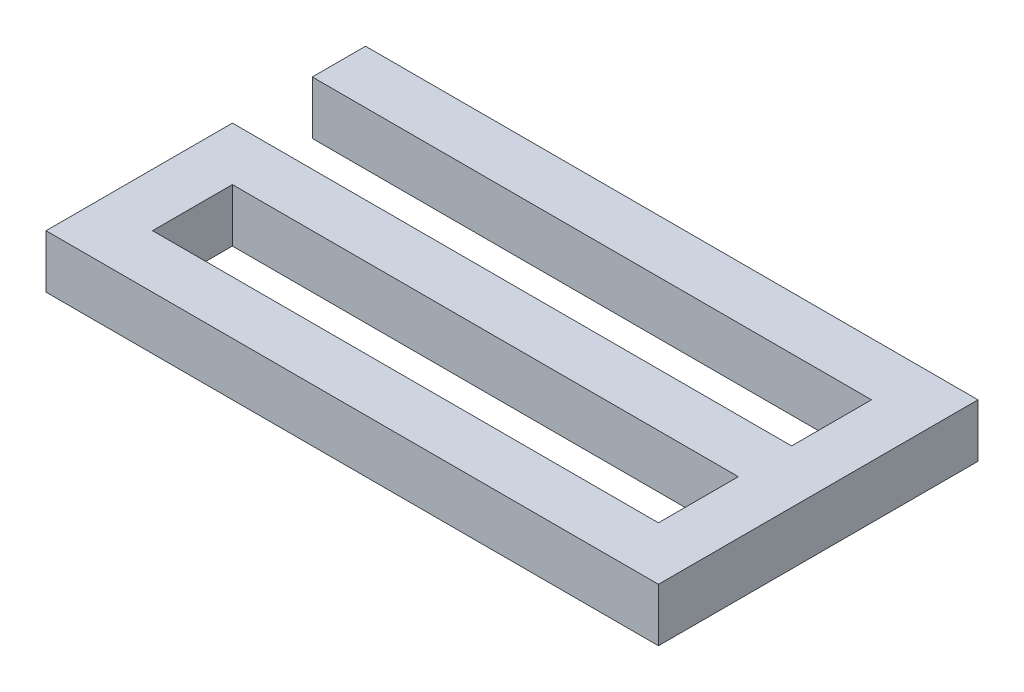
ISO-10303-21;
HEADER;
FILE_DESCRIPTION(('STEP AP214'),'2;1');
FILE_NAME('part.step','',(''),(''),'','','');
FILE_SCHEMA(('AUTOMOTIVE_DESIGN { 1 0 10303 214 1 1 1 1 }'));
ENDSEC;
DATA;
#1=APPLICATION_CONTEXT('core data for automotive mechanical design processes');
#2=APPLICATION_PROTOCOL_DEFINITION('international standard','automotive_design',2000,#1);
#3=PRODUCT_CONTEXT('',#1,'mechanical');
#4=PRODUCT('Part','Part','',(#3));
#5=PRODUCT_RELATED_PRODUCT_CATEGORY('part','',(#4));
#6=PRODUCT_DEFINITION_FORMATION('','',#4);
#7=PRODUCT_DEFINITION_CONTEXT('part definition',#1,'design');
#8=PRODUCT_DEFINITION('design','',#6,#7);
#9=PRODUCT_DEFINITION_SHAPE('','',#8);
#10=(LENGTH_UNIT() NAMED_UNIT(*) SI_UNIT(.MILLI.,.METRE.));
#11=(NAMED_UNIT(*) PLANE_ANGLE_UNIT() SI_UNIT($,.RADIAN.));
#12=(NAMED_UNIT(*) SI_UNIT($,.STERADIAN.) SOLID_ANGLE_UNIT());
#13=UNCERTAINTY_MEASURE_WITH_UNIT(LENGTH_MEASURE(1.E-05),#10,'distance_accuracy_value','');
#14=(GEOMETRIC_REPRESENTATION_CONTEXT(3) GLOBAL_UNCERTAINTY_ASSIGNED_CONTEXT((#13)) GLOBAL_UNIT_ASSIGNED_CONTEXT((#10,
#11,#12)) REPRESENTATION_CONTEXT('',''));
#15=CARTESIAN_POINT('',(0.,0.,0.));
#16=DIRECTION('',(0.,0.,1.));
#17=DIRECTION('',(1.,0.,0.));
#18=AXIS2_PLACEMENT_3D('',#15,#16,#17);
#19=CARTESIAN_POINT('',(0.,2.,0.));
#20=DIRECTION('',(0.,1.,0.));
#21=DIRECTION('',(0.,0.,1.));
#22=AXIS2_PLACEMENT_3D('',#19,#20,#21);
#23=PLANE('',#22);
#24=DIRECTION('',(0.,0.,1.));
#25=VECTOR('',#24,1.);
#26=CARTESIAN_POINT('',(-10.4794745484401,2.,-11.375));
#27=LINE('',#26,#25);
#28=CARTESIAN_POINT('',(-10.4794745484401,2.,-11.375));
#29=VERTEX_POINT('',#28);
#30=CARTESIAN_POINT('',(-10.4794745484401,2.,-9.375));
#31=VERTEX_POINT('',#30);
#32=EDGE_CURVE('E158',#29,#31,#27,.T.);
#33=ORIENTED_EDGE('',*,*,#32,.T.);
#34=DIRECTION('',(1.,0.,0.));
#35=VECTOR('',#34,1.);
#36=CARTESIAN_POINT('',(-10.4794745484401,2.,-9.375));
#37=LINE('',#36,#35);
#38=CARTESIAN_POINT('',(10.5205254515599,2.,-9.375));
#39=VERTEX_POINT('',#38);
#40=EDGE_CURVE('E161',#31,#39,#37,.T.);
#41=ORIENTED_EDGE('',*,*,#40,.T.);
#42=DIRECTION('',(0.,0.,1.));
#43=VECTOR('',#42,1.);
#44=CARTESIAN_POINT('',(10.5205254515599,2.,-9.375));
#45=LINE('',#44,#43);
#46=CARTESIAN_POINT('',(10.5205254515599,2.,-6.375));
#47=VERTEX_POINT('',#46);
#48=EDGE_CURVE('E164',#39,#47,#45,.T.);
#49=ORIENTED_EDGE('',*,*,#48,.T.);
#50=DIRECTION('',(-1.,0.,0.));
#51=VECTOR('',#50,1.);
#52=CARTESIAN_POINT('',(-10.4794745484401,2.,-6.375));
#53=LINE('',#52,#51);
#54=CARTESIAN_POINT('',(-10.4794745484401,2.,-6.375));
#55=VERTEX_POINT('',#54);
#56=EDGE_CURVE('E166',#47,#55,#53,.T.);
#57=ORIENTED_EDGE('',*,*,#56,.T.);
#58=DIRECTION('',(0.,0.,1.));
#59=VECTOR('',#58,1.);
#60=CARTESIAN_POINT('',(-10.4794745484401,2.,-6.375));
#61=LINE('',#60,#59);
#62=CARTESIAN_POINT('',(-10.4794745484401,2.,0.625000000000001));
#63=VERTEX_POINT('',#62);
#64=EDGE_CURVE('E168',#55,#63,#61,.T.);
#65=ORIENTED_EDGE('',*,*,#64,.T.);
#66=DIRECTION('',(1.,0.,0.));
#67=VECTOR('',#66,1.);
#68=CARTESIAN_POINT('',(10.5205254515599,2.,0.625000000000001));
#69=LINE('',#68,#67);
#70=CARTESIAN_POINT('',(12.5205254515599,2.,0.625));
#71=VERTEX_POINT('',#70);
#72=EDGE_CURVE('E170',#63,#71,#69,.T.);
#73=ORIENTED_EDGE('',*,*,#72,.T.);
#74=DIRECTION('',(0.,0.,-1.));
#75=VECTOR('',#74,1.);
#76=CARTESIAN_POINT('',(12.5205254515599,2.,-11.375));
#77=LINE('',#76,#75);
#78=CARTESIAN_POINT('',(12.5205254515599,2.,-11.375));
#79=VERTEX_POINT('',#78);
#80=EDGE_CURVE('E172',#71,#79,#77,.T.);
#81=ORIENTED_EDGE('',*,*,#80,.T.);
#82=DIRECTION('',(-1.,0.,0.));
#83=VECTOR('',#82,1.);
#84=CARTESIAN_POINT('',(-10.4794745484401,2.,-11.375));
#85=LINE('',#84,#83);
#86=EDGE_CURVE('E174',#79,#29,#85,.T.);
#87=ORIENTED_EDGE('',*,*,#86,.T.);
#88=EDGE_LOOP('',(#33,#41,#49,#57,#65,#73,#81,#87));
#89=FACE_BOUND('',#88,.T.);
#90=DIRECTION('',(-1.,0.,0.));
#91=VECTOR('',#90,1.);
#92=CARTESIAN_POINT('',(-8.47947454844007,2.,-4.375));
#93=LINE('',#92,#91);
#94=CARTESIAN_POINT('',(10.5205254515599,2.,-4.375));
#95=VERTEX_POINT('',#94);
#96=CARTESIAN_POINT('',(-8.47947454844007,2.,-4.375));
#97=VERTEX_POINT('',#96);
#98=EDGE_CURVE('E130',#95,#97,#93,.T.);
#99=ORIENTED_EDGE('',*,*,#98,.F.);
#100=DIRECTION('',(0.,0.,-1.));
#101=VECTOR('',#100,1.);
#102=CARTESIAN_POINT('',(10.5205254515599,2.,-4.375));
#103=LINE('',#102,#101);
#104=CARTESIAN_POINT('',(10.5205254515599,2.,-1.375));
#105=VERTEX_POINT('',#104);
#106=EDGE_CURVE('E122',#105,#95,#103,.T.);
#107=ORIENTED_EDGE('',*,*,#106,.F.);
#108=DIRECTION('',(1.,0.,0.));
#109=VECTOR('',#108,1.);
#110=CARTESIAN_POINT('',(10.5205254515599,2.,-1.375));
#111=LINE('',#110,#109);
#112=CARTESIAN_POINT('',(-8.47947454844007,2.,-1.375));
#113=VERTEX_POINT('',#112);
#114=EDGE_CURVE('E144',#113,#105,#111,.T.);
#115=ORIENTED_EDGE('',*,*,#114,.F.);
#116=DIRECTION('',(0.,0.,1.));
#117=VECTOR('',#116,1.);
#118=CARTESIAN_POINT('',(-8.47947454844007,2.,-4.375));
#119=LINE('',#118,#117);
#120=EDGE_CURVE('E142',#97,#113,#119,.T.);
#121=ORIENTED_EDGE('',*,*,#120,.F.);
#122=EDGE_LOOP('',(#99,#107,#115,#121));
#123=FACE_BOUND('',#122,.T.);
#124=ADVANCED_FACE('F33',(#89,#123),#23,.T.);
#125=CARTESIAN_POINT('',(0.,0.,0.));
#126=DIRECTION('',(0.,1.,0.));
#127=DIRECTION('',(0.,0.,1.));
#128=AXIS2_PLACEMENT_3D('',#125,#126,#127);
#129=PLANE('',#128);
#130=DIRECTION('',(0.,0.,1.));
#131=VECTOR('',#130,1.);
#132=CARTESIAN_POINT('',(-10.4794745484401,0.,-11.375));
#133=LINE('',#132,#131);
#134=CARTESIAN_POINT('',(-10.4794745484401,0.,-11.375));
#135=VERTEX_POINT('',#134);
#136=CARTESIAN_POINT('',(-10.4794745484401,0.,-9.375));
#137=VERTEX_POINT('',#136);
#138=EDGE_CURVE('E138',#135,#137,#133,.T.);
#139=ORIENTED_EDGE('',*,*,#138,.F.);
#140=DIRECTION('',(-1.,0.,0.));
#141=VECTOR('',#140,1.);
#142=CARTESIAN_POINT('',(-10.4794745484401,0.,-11.375));
#143=LINE('',#142,#141);
#144=CARTESIAN_POINT('',(12.5205254515599,0.,-11.375));
#145=VERTEX_POINT('',#144);
#146=EDGE_CURVE('E162',#145,#135,#143,.T.);
#147=ORIENTED_EDGE('',*,*,#146,.F.);
#148=DIRECTION('',(0.,0.,-1.));
#149=VECTOR('',#148,1.);
#150=CARTESIAN_POINT('',(12.5205254515599,0.,-11.375));
#151=LINE('',#150,#149);
#152=CARTESIAN_POINT('',(12.5205254515599,0.,0.625));
#153=VERTEX_POINT('',#152);
#154=EDGE_CURVE('E190',#153,#145,#151,.T.);
#155=ORIENTED_EDGE('',*,*,#154,.F.);
#156=DIRECTION('',(1.,0.,0.));
#157=VECTOR('',#156,1.);
#158=CARTESIAN_POINT('',(12.5205254515599,0.,0.625));
#159=LINE('',#158,#157);
#160=CARTESIAN_POINT('',(-10.4794745484401,0.,0.625000000000001));
#161=VERTEX_POINT('',#160);
#162=EDGE_CURVE('E188',#161,#153,#159,.T.);
#163=ORIENTED_EDGE('',*,*,#162,.F.);
#164=DIRECTION('',(0.,0.,1.));
#165=VECTOR('',#164,1.);
#166=CARTESIAN_POINT('',(-10.4794745484401,0.,-6.375));
#167=LINE('',#166,#165);
#168=CARTESIAN_POINT('',(-10.4794745484401,0.,-6.375));
#169=VERTEX_POINT('',#168);
#170=EDGE_CURVE('E185',#169,#161,#167,.T.);
#171=ORIENTED_EDGE('',*,*,#170,.F.);
#172=DIRECTION('',(-1.,0.,0.));
#173=VECTOR('',#172,1.);
#174=CARTESIAN_POINT('',(-10.4794745484401,0.,-6.375));
#175=LINE('',#174,#173);
#176=CARTESIAN_POINT('',(10.5205254515599,0.,-6.375));
#177=VERTEX_POINT('',#176);
#178=EDGE_CURVE('E183',#177,#169,#175,.T.);
#179=ORIENTED_EDGE('',*,*,#178,.F.);
#180=DIRECTION('',(0.,0.,1.));
#181=VECTOR('',#180,1.);
#182=CARTESIAN_POINT('',(10.5205254515599,0.,-9.375));
#183=LINE('',#182,#181);
#184=CARTESIAN_POINT('',(10.5205254515599,0.,-9.375));
#185=VERTEX_POINT('',#184);
#186=EDGE_CURVE('E181',#185,#177,#183,.T.);
#187=ORIENTED_EDGE('',*,*,#186,.F.);
#188=DIRECTION('',(1.,0.,0.));
#189=VECTOR('',#188,1.);
#190=CARTESIAN_POINT('',(-10.4794745484401,0.,-9.375));
#191=LINE('',#190,#189);
#192=EDGE_CURVE('E179',#137,#185,#191,.T.);
#193=ORIENTED_EDGE('',*,*,#192,.F.);
#194=EDGE_LOOP('',(#139,#147,#155,#163,#171,#179,#187,#193));
#195=FACE_BOUND('',#194,.T.);
#196=DIRECTION('',(0.,0.,-1.));
#197=VECTOR('',#196,1.);
#198=CARTESIAN_POINT('',(10.5205254515599,0.,-4.375));
#199=LINE('',#198,#197);
#200=CARTESIAN_POINT('',(10.5205254515599,0.,-1.375));
#201=VERTEX_POINT('',#200);
#202=CARTESIAN_POINT('',(10.5205254515599,0.,-4.375));
#203=VERTEX_POINT('',#202);
#204=EDGE_CURVE('E56',#201,#203,#199,.T.);
#205=ORIENTED_EDGE('',*,*,#204,.T.);
#206=DIRECTION('',(-1.,0.,0.));
#207=VECTOR('',#206,1.);
#208=CARTESIAN_POINT('',(-8.47947454844007,0.,-4.375));
#209=LINE('',#208,#207);
#210=CARTESIAN_POINT('',(-8.47947454844007,0.,-4.375));
#211=VERTEX_POINT('',#210);
#212=EDGE_CURVE('E137',#203,#211,#209,.T.);
#213=ORIENTED_EDGE('',*,*,#212,.T.);
#214=DIRECTION('',(0.,0.,1.));
#215=VECTOR('',#214,1.);
#216=CARTESIAN_POINT('',(-8.47947454844007,0.,-4.375));
#217=LINE('',#216,#215);
#218=CARTESIAN_POINT('',(-8.47947454844007,0.,-1.375));
#219=VERTEX_POINT('',#218);
#220=EDGE_CURVE('E150',#211,#219,#217,.T.);
#221=ORIENTED_EDGE('',*,*,#220,.T.);
#222=DIRECTION('',(1.,0.,0.));
#223=VECTOR('',#222,1.);
#224=CARTESIAN_POINT('',(10.5205254515599,0.,-1.375));
#225=LINE('',#224,#223);
#226=EDGE_CURVE('E131',#219,#201,#225,.T.);
#227=ORIENTED_EDGE('',*,*,#226,.T.);
#228=EDGE_LOOP('',(#205,#213,#221,#227));
#229=FACE_BOUND('',#228,.T.);
#230=ADVANCED_FACE('F220',(#195,#229),#129,.F.);
#231=CARTESIAN_POINT('',(-10.4794745484401,2.,-11.375));
#232=DIRECTION('',(1.,0.,0.));
#233=DIRECTION('',(0.,0.,-1.));
#234=AXIS2_PLACEMENT_3D('',#231,#232,#233);
#235=PLANE('',#234);
#236=ORIENTED_EDGE('',*,*,#138,.T.);
#237=DIRECTION('',(0.,-1.,0.));
#238=VECTOR('',#237,1.);
#239=CARTESIAN_POINT('',(-10.4794745484401,2.,-9.375));
#240=LINE('',#239,#238);
#241=EDGE_CURVE('E11',#31,#137,#240,.T.);
#242=ORIENTED_EDGE('',*,*,#241,.F.);
#243=ORIENTED_EDGE('',*,*,#32,.F.);
#244=DIRECTION('',(0.,-1.,0.));
#245=VECTOR('',#244,1.);
#246=CARTESIAN_POINT('',(-10.4794745484401,2.,-11.375));
#247=LINE('',#246,#245);
#248=EDGE_CURVE('E176',#29,#135,#247,.T.);
#249=ORIENTED_EDGE('',*,*,#248,.T.);
#250=EDGE_LOOP('',(#236,#242,#243,#249));
#251=FACE_BOUND('',#250,.T.);
#252=ADVANCED_FACE('F35',(#251),#235,.F.);
#253=CARTESIAN_POINT('',(-10.4794745484401,2.,-9.375));
#254=DIRECTION('',(0.,0.,-1.));
#255=DIRECTION('',(-1.,0.,0.));
#256=AXIS2_PLACEMENT_3D('',#253,#254,#255);
#257=PLANE('',#256);
#258=ORIENTED_EDGE('',*,*,#192,.T.);
#259=DIRECTION('',(0.,-1.,0.));
#260=VECTOR('',#259,1.);
#261=CARTESIAN_POINT('',(10.5205254515599,2.,-9.375));
#262=LINE('',#261,#260);
#263=EDGE_CURVE('E41',#39,#185,#262,.T.);
#264=ORIENTED_EDGE('',*,*,#263,.F.);
#265=ORIENTED_EDGE('',*,*,#40,.F.);
#266=ORIENTED_EDGE('',*,*,#241,.T.);
#267=EDGE_LOOP('',(#258,#264,#265,#266));
#268=FACE_BOUND('',#267,.T.);
#269=ADVANCED_FACE('F236',(#268),#257,.F.);
#270=CARTESIAN_POINT('',(10.5205254515599,2.,-9.375));
#271=DIRECTION('',(1.,0.,0.));
#272=DIRECTION('',(0.,0.,-1.));
#273=AXIS2_PLACEMENT_3D('',#270,#271,#272);
#274=PLANE('',#273);
#275=ORIENTED_EDGE('',*,*,#186,.T.);
#276=DIRECTION('',(0.,-1.,0.));
#277=VECTOR('',#276,1.);
#278=CARTESIAN_POINT('',(10.5205254515599,2.,-6.375));
#279=LINE('',#278,#277);
#280=EDGE_CURVE('E207',#47,#177,#279,.T.);
#281=ORIENTED_EDGE('',*,*,#280,.F.);
#282=ORIENTED_EDGE('',*,*,#48,.F.);
#283=ORIENTED_EDGE('',*,*,#263,.T.);
#284=EDGE_LOOP('',(#275,#281,#282,#283));
#285=FACE_BOUND('',#284,.T.);
#286=ADVANCED_FACE('F214',(#285),#274,.F.);
#287=CARTESIAN_POINT('',(-10.4794745484401,2.,-6.375));
#288=DIRECTION('',(0.,0.,1.));
#289=DIRECTION('',(1.,0.,0.));
#290=AXIS2_PLACEMENT_3D('',#287,#288,#289);
#291=PLANE('',#290);
#292=ORIENTED_EDGE('',*,*,#178,.T.);
#293=DIRECTION('',(0.,-1.,0.));
#294=VECTOR('',#293,1.);
#295=CARTESIAN_POINT('',(-10.4794745484401,2.,-6.375));
#296=LINE('',#295,#294);
#297=EDGE_CURVE('E204',#55,#169,#296,.T.);
#298=ORIENTED_EDGE('',*,*,#297,.F.);
#299=ORIENTED_EDGE('',*,*,#56,.F.);
#300=ORIENTED_EDGE('',*,*,#280,.T.);
#301=EDGE_LOOP('',(#292,#298,#299,#300));
#302=FACE_BOUND('',#301,.T.);
#303=ADVANCED_FACE('F225',(#302),#291,.F.);
#304=CARTESIAN_POINT('',(-10.4794745484401,2.,-6.375));
#305=DIRECTION('',(1.,0.,0.));
#306=DIRECTION('',(0.,0.,-1.));
#307=AXIS2_PLACEMENT_3D('',#304,#305,#306);
#308=PLANE('',#307);
#309=ORIENTED_EDGE('',*,*,#170,.T.);
#310=DIRECTION('',(0.,-1.,0.));
#311=VECTOR('',#310,1.);
#312=CARTESIAN_POINT('',(-10.4794745484401,2.,0.625000000000001));
#313=LINE('',#312,#311);
#314=EDGE_CURVE('E201',#63,#161,#313,.T.);
#315=ORIENTED_EDGE('',*,*,#314,.F.);
#316=ORIENTED_EDGE('',*,*,#64,.F.);
#317=ORIENTED_EDGE('',*,*,#297,.T.);
#318=EDGE_LOOP('',(#309,#315,#316,#317));
#319=FACE_BOUND('',#318,.T.);
#320=ADVANCED_FACE('F229',(#319),#308,.F.);
#321=CARTESIAN_POINT('',(12.5205254515599,2.,0.625));
#322=DIRECTION('',(0.,0.,-1.));
#323=DIRECTION('',(-1.,0.,0.));
#324=AXIS2_PLACEMENT_3D('',#321,#322,#323);
#325=PLANE('',#324);
#326=ORIENTED_EDGE('',*,*,#162,.T.);
#327=DIRECTION('',(0.,-1.,0.));
#328=VECTOR('',#327,1.);
#329=CARTESIAN_POINT('',(12.5205254515599,2.,0.625));
#330=LINE('',#329,#328);
#331=EDGE_CURVE('E198',#71,#153,#330,.T.);
#332=ORIENTED_EDGE('',*,*,#331,.F.);
#333=ORIENTED_EDGE('',*,*,#72,.F.);
#334=ORIENTED_EDGE('',*,*,#314,.T.);
#335=EDGE_LOOP('',(#326,#332,#333,#334));
#336=FACE_BOUND('',#335,.T.);
#337=ADVANCED_FACE('F249',(#336),#325,.F.);
#338=CARTESIAN_POINT('',(12.5205254515599,2.,-11.375));
#339=DIRECTION('',(-1.,0.,0.));
#340=DIRECTION('',(0.,0.,1.));
#341=AXIS2_PLACEMENT_3D('',#338,#339,#340);
#342=PLANE('',#341);
#343=ORIENTED_EDGE('',*,*,#154,.T.);
#344=DIRECTION('',(0.,-1.,0.));
#345=VECTOR('',#344,1.);
#346=CARTESIAN_POINT('',(12.5205254515599,2.,-11.375));
#347=LINE('',#346,#345);
#348=EDGE_CURVE('E195',#79,#145,#347,.T.);
#349=ORIENTED_EDGE('',*,*,#348,.F.);
#350=ORIENTED_EDGE('',*,*,#80,.F.);
#351=ORIENTED_EDGE('',*,*,#331,.T.);
#352=EDGE_LOOP('',(#343,#349,#350,#351));
#353=FACE_BOUND('',#352,.T.);
#354=ADVANCED_FACE('F247',(#353),#342,.F.);
#355=CARTESIAN_POINT('',(-10.4794745484401,2.,-11.375));
#356=DIRECTION('',(0.,0.,1.));
#357=DIRECTION('',(1.,0.,0.));
#358=AXIS2_PLACEMENT_3D('',#355,#356,#357);
#359=PLANE('',#358);
#360=ORIENTED_EDGE('',*,*,#146,.T.);
#361=ORIENTED_EDGE('',*,*,#248,.F.);
#362=ORIENTED_EDGE('',*,*,#86,.F.);
#363=ORIENTED_EDGE('',*,*,#348,.T.);
#364=EDGE_LOOP('',(#360,#361,#362,#363));
#365=FACE_BOUND('',#364,.T.);
#366=ADVANCED_FACE('F242',(#365),#359,.F.);
#367=CARTESIAN_POINT('',(10.5205254515599,2.,-4.375));
#368=DIRECTION('',(-1.,0.,0.));
#369=DIRECTION('',(0.,0.,1.));
#370=AXIS2_PLACEMENT_3D('',#367,#368,#369);
#371=PLANE('',#370);
#372=ORIENTED_EDGE('',*,*,#204,.F.);
#373=DIRECTION('',(0.,-1.,0.));
#374=VECTOR('',#373,1.);
#375=CARTESIAN_POINT('',(10.5205254515599,2.,-1.375));
#376=LINE('',#375,#374);
#377=EDGE_CURVE('E126',#105,#201,#376,.T.);
#378=ORIENTED_EDGE('',*,*,#377,.F.);
#379=ORIENTED_EDGE('',*,*,#106,.T.);
#380=DIRECTION('',(0.,-1.,0.));
#381=VECTOR('',#380,1.);
#382=CARTESIAN_POINT('',(10.5205254515599,2.,-4.375));
#383=LINE('',#382,#381);
#384=EDGE_CURVE('E125',#95,#203,#383,.T.);
#385=ORIENTED_EDGE('',*,*,#384,.T.);
#386=EDGE_LOOP('',(#372,#378,#379,#385));
#387=FACE_BOUND('',#386,.T.);
#388=ADVANCED_FACE('F124',(#387),#371,.T.);
#389=CARTESIAN_POINT('',(-8.47947454844007,2.,-4.375));
#390=DIRECTION('',(0.,0.,1.));
#391=DIRECTION('',(1.,0.,0.));
#392=AXIS2_PLACEMENT_3D('',#389,#390,#391);
#393=PLANE('',#392);
#394=ORIENTED_EDGE('',*,*,#212,.F.);
#395=ORIENTED_EDGE('',*,*,#384,.F.);
#396=ORIENTED_EDGE('',*,*,#98,.T.);
#397=DIRECTION('',(0.,-1.,0.));
#398=VECTOR('',#397,1.);
#399=CARTESIAN_POINT('',(-8.47947454844007,2.,-4.375));
#400=LINE('',#399,#398);
#401=EDGE_CURVE('E139',#97,#211,#400,.T.);
#402=ORIENTED_EDGE('',*,*,#401,.T.);
#403=EDGE_LOOP('',(#394,#395,#396,#402));
#404=FACE_BOUND('',#403,.T.);
#405=ADVANCED_FACE('F134',(#404),#393,.T.);
#406=CARTESIAN_POINT('',(-8.47947454844007,2.,-4.375));
#407=DIRECTION('',(1.,0.,0.));
#408=DIRECTION('',(0.,0.,-1.));
#409=AXIS2_PLACEMENT_3D('',#406,#407,#408);
#410=PLANE('',#409);
#411=ORIENTED_EDGE('',*,*,#220,.F.);
#412=ORIENTED_EDGE('',*,*,#401,.F.);
#413=ORIENTED_EDGE('',*,*,#120,.T.);
#414=DIRECTION('',(0.,-1.,0.));
#415=VECTOR('',#414,1.);
#416=CARTESIAN_POINT('',(-8.47947454844007,2.,-1.375));
#417=LINE('',#416,#415);
#418=EDGE_CURVE('E48',#113,#219,#417,.T.);
#419=ORIENTED_EDGE('',*,*,#418,.T.);
#420=EDGE_LOOP('',(#411,#412,#413,#419));
#421=FACE_BOUND('',#420,.T.);
#422=ADVANCED_FACE('F274',(#421),#410,.T.);
#423=CARTESIAN_POINT('',(10.5205254515599,2.,-1.375));
#424=DIRECTION('',(0.,0.,-1.));
#425=DIRECTION('',(-1.,0.,0.));
#426=AXIS2_PLACEMENT_3D('',#423,#424,#425);
#427=PLANE('',#426);
#428=ORIENTED_EDGE('',*,*,#226,.F.);
#429=ORIENTED_EDGE('',*,*,#418,.F.);
#430=ORIENTED_EDGE('',*,*,#114,.T.);
#431=ORIENTED_EDGE('',*,*,#377,.T.);
#432=EDGE_LOOP('',(#428,#429,#430,#431));
#433=FACE_BOUND('',#432,.T.);
#434=ADVANCED_FACE('F278',(#433),#427,.T.);
#435=CLOSED_SHELL('',(#124,#230,#252,#269,#286,#303,#320,#337,#354,#366,#388,#405,#422,#434));
#436=MANIFOLD_SOLID_BREP('B2',#435);
#437=ADVANCED_BREP_SHAPE_REPRESENTATION('',(#18,#436),#14);
#438=SHAPE_DEFINITION_REPRESENTATION(#9,#437);
ENDSEC;
END-ISO-10303-21;
